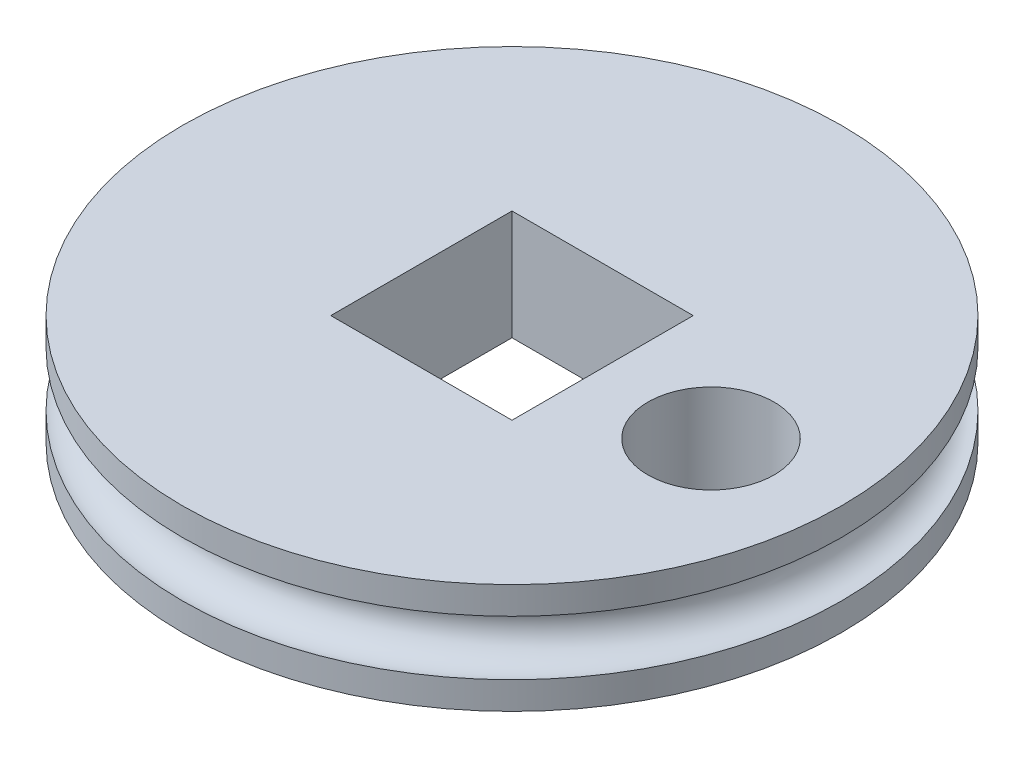
ISO-10303-21;
HEADER;
FILE_DESCRIPTION(('STEP AP214'),'2;1');
FILE_NAME('part.step','',(''),(''),'','','');
FILE_SCHEMA(('AUTOMOTIVE_DESIGN { 1 0 10303 214 1 1 1 1 }'));
ENDSEC;
DATA;
#1=APPLICATION_CONTEXT('core data for automotive mechanical design processes');
#2=APPLICATION_PROTOCOL_DEFINITION('international standard','automotive_design',2000,#1);
#3=PRODUCT_CONTEXT('',#1,'mechanical');
#4=PRODUCT('Part','Part','',(#3));
#5=PRODUCT_RELATED_PRODUCT_CATEGORY('part','',(#4));
#6=PRODUCT_DEFINITION_FORMATION('','',#4);
#7=PRODUCT_DEFINITION_CONTEXT('part definition',#1,'design');
#8=PRODUCT_DEFINITION('design','',#6,#7);
#9=PRODUCT_DEFINITION_SHAPE('','',#8);
#10=(LENGTH_UNIT() NAMED_UNIT(*) SI_UNIT(.MILLI.,.METRE.));
#11=(NAMED_UNIT(*) PLANE_ANGLE_UNIT() SI_UNIT($,.RADIAN.));
#12=(NAMED_UNIT(*) SI_UNIT($,.STERADIAN.) SOLID_ANGLE_UNIT());
#13=UNCERTAINTY_MEASURE_WITH_UNIT(LENGTH_MEASURE(1.E-05),#10,'distance_accuracy_value','');
#14=(GEOMETRIC_REPRESENTATION_CONTEXT(3) GLOBAL_UNCERTAINTY_ASSIGNED_CONTEXT((#13)) GLOBAL_UNIT_ASSIGNED_CONTEXT((#10,
#11,#12)) REPRESENTATION_CONTEXT('',''));
#15=CARTESIAN_POINT('',(0.,0.,0.));
#16=DIRECTION('',(0.,0.,1.));
#17=DIRECTION('',(1.,0.,0.));
#18=AXIS2_PLACEMENT_3D('',#15,#16,#17);
#19=CARTESIAN_POINT('',(0.,2.,0.));
#20=DIRECTION('',(0.,-1.,0.));
#21=DIRECTION('',(0.,0.,-1.));
#22=AXIS2_PLACEMENT_3D('',#19,#20,#21);
#23=CYLINDRICAL_SURFACE('',#22,6.);
#24=CARTESIAN_POINT('',(0.,1.5,0.));
#25=DIRECTION('',(0.,1.,0.));
#26=DIRECTION('',(0.,0.,1.));
#27=AXIS2_PLACEMENT_3D('',#24,#25,#26);
#28=CIRCLE('',#27,6.);
#29=CARTESIAN_POINT('',(0.,1.5,6.));
#30=VERTEX_POINT('',#29);
#31=EDGE_CURVE('E162',#30,#30,#28,.T.);
#32=ORIENTED_EDGE('',*,*,#31,.T.);
#33=EDGE_LOOP('',(#32));
#34=FACE_BOUND('',#33,.T.);
#35=CARTESIAN_POINT('',(0.,2.,0.));
#36=DIRECTION('',(0.,1.,0.));
#37=DIRECTION('',(0.,0.,1.));
#38=AXIS2_PLACEMENT_3D('',#35,#36,#37);
#39=CIRCLE('',#38,6.);
#40=CARTESIAN_POINT('',(0.,2.,6.));
#41=VERTEX_POINT('',#40);
#42=EDGE_CURVE('E122',#41,#41,#39,.T.);
#43=ORIENTED_EDGE('',*,*,#42,.F.);
#44=EDGE_LOOP('',(#43));
#45=FACE_BOUND('',#44,.T.);
#46=ADVANCED_FACE('F43',(#34,#45),#23,.T.);
#47=CARTESIAN_POINT('',(0.,0.5,0.));
#48=DIRECTION('',(0.,1.,0.));
#49=DIRECTION('',(0.,0.,1.));
#50=AXIS2_PLACEMENT_3D('',#47,#48,#49);
#51=CIRCLE('',#50,6.);
#52=CARTESIAN_POINT('',(0.,0.5,6.));
#53=VERTEX_POINT('',#52);
#54=EDGE_CURVE('E173',#53,#53,#51,.T.);
#55=ORIENTED_EDGE('',*,*,#54,.F.);
#56=EDGE_LOOP('',(#55));
#57=FACE_BOUND('',#56,.T.);
#58=CARTESIAN_POINT('',(0.,0.,0.));
#59=DIRECTION('',(0.,1.,0.));
#60=DIRECTION('',(0.,0.,1.));
#61=AXIS2_PLACEMENT_3D('',#58,#59,#60);
#62=CIRCLE('',#61,6.);
#63=CARTESIAN_POINT('',(0.,0.,6.));
#64=VERTEX_POINT('',#63);
#65=EDGE_CURVE('E117',#64,#64,#62,.T.);
#66=ORIENTED_EDGE('',*,*,#65,.T.);
#67=EDGE_LOOP('',(#66));
#68=FACE_BOUND('',#67,.T.);
#69=ADVANCED_FACE('F45',(#57,#68),#23,.T.);
#70=CARTESIAN_POINT('',(0.,2.,0.));
#71=DIRECTION('',(0.,1.,0.));
#72=DIRECTION('',(0.,0.,1.));
#73=AXIS2_PLACEMENT_3D('',#70,#71,#72);
#74=PLANE('',#73);
#75=CARTESIAN_POINT('',(3.75,2.,0.12644610797885));
#76=DIRECTION('',(0.,1.,0.));
#77=DIRECTION('',(0.,0.,1.));
#78=AXIS2_PLACEMENT_3D('',#75,#76,#77);
#79=CIRCLE('',#78,1.15);
#80=CARTESIAN_POINT('',(3.75,2.,1.27644610797885));
#81=VERTEX_POINT('',#80);
#82=EDGE_CURVE('E170',#81,#81,#79,.T.);
#83=ORIENTED_EDGE('',*,*,#82,.F.);
#84=EDGE_LOOP('',(#83));
#85=FACE_BOUND('',#84,.T.);
#86=DIRECTION('',(0.,0.,-1.));
#87=VECTOR('',#86,1.);
#88=CARTESIAN_POINT('',(1.65,2.,-1.65));
#89=LINE('',#88,#87);
#90=CARTESIAN_POINT('',(1.65,2.,1.65));
#91=VERTEX_POINT('',#90);
#92=CARTESIAN_POINT('',(1.65,2.,-1.65));
#93=VERTEX_POINT('',#92);
#94=EDGE_CURVE('E60',#91,#93,#89,.T.);
#95=ORIENTED_EDGE('',*,*,#94,.F.);
#96=DIRECTION('',(1.,0.,0.));
#97=VECTOR('',#96,1.);
#98=CARTESIAN_POINT('',(1.65,2.,1.65));
#99=LINE('',#98,#97);
#100=CARTESIAN_POINT('',(-1.65,2.,1.65));
#101=VERTEX_POINT('',#100);
#102=EDGE_CURVE('E107',#101,#91,#99,.T.);
#103=ORIENTED_EDGE('',*,*,#102,.F.);
#104=DIRECTION('',(0.,0.,1.));
#105=VECTOR('',#104,1.);
#106=CARTESIAN_POINT('',(-1.65,2.,-1.65));
#107=LINE('',#106,#105);
#108=CARTESIAN_POINT('',(-1.65,2.,-1.65));
#109=VERTEX_POINT('',#108);
#110=EDGE_CURVE('E89',#109,#101,#107,.T.);
#111=ORIENTED_EDGE('',*,*,#110,.F.);
#112=DIRECTION('',(-1.,0.,0.));
#113=VECTOR('',#112,1.);
#114=CARTESIAN_POINT('',(1.65,2.,-1.65));
#115=LINE('',#114,#113);
#116=EDGE_CURVE('E99',#93,#109,#115,.T.);
#117=ORIENTED_EDGE('',*,*,#116,.F.);
#118=EDGE_LOOP('',(#95,#103,#111,#117));
#119=FACE_BOUND('',#118,.T.);
#120=ORIENTED_EDGE('',*,*,#42,.T.);
#121=EDGE_LOOP('',(#120));
#122=FACE_BOUND('',#121,.T.);
#123=ADVANCED_FACE('F104',(#85,#119,#122),#74,.T.);
#124=CARTESIAN_POINT('',(0.,0.,0.));
#125=DIRECTION('',(0.,1.,0.));
#126=DIRECTION('',(0.,0.,1.));
#127=AXIS2_PLACEMENT_3D('',#124,#125,#126);
#128=PLANE('',#127);
#129=CARTESIAN_POINT('',(3.75,0.,0.12644610797885));
#130=DIRECTION('',(0.,1.,0.));
#131=DIRECTION('',(0.,0.,1.));
#132=AXIS2_PLACEMENT_3D('',#129,#130,#131);
#133=CIRCLE('',#132,1.15);
#134=CARTESIAN_POINT('',(3.75,0.,1.27644610797885));
#135=VERTEX_POINT('',#134);
#136=EDGE_CURVE('E47',#135,#135,#133,.T.);
#137=ORIENTED_EDGE('',*,*,#136,.T.);
#138=EDGE_LOOP('',(#137));
#139=FACE_BOUND('',#138,.T.);
#140=DIRECTION('',(1.,0.,0.));
#141=VECTOR('',#140,1.);
#142=CARTESIAN_POINT('',(0.,0.,1.65));
#143=LINE('',#142,#141);
#144=CARTESIAN_POINT('',(-1.65,0.,1.65));
#145=VERTEX_POINT('',#144);
#146=CARTESIAN_POINT('',(1.65,0.,1.65));
#147=VERTEX_POINT('',#146);
#148=EDGE_CURVE('E53',#145,#147,#143,.T.);
#149=ORIENTED_EDGE('',*,*,#148,.T.);
#150=DIRECTION('',(0.,0.,-1.));
#151=VECTOR('',#150,1.);
#152=CARTESIAN_POINT('',(1.65,0.,0.));
#153=LINE('',#152,#151);
#154=CARTESIAN_POINT('',(1.65,0.,-1.65));
#155=VERTEX_POINT('',#154);
#156=EDGE_CURVE('E11',#147,#155,#153,.T.);
#157=ORIENTED_EDGE('',*,*,#156,.T.);
#158=DIRECTION('',(-1.,0.,0.));
#159=VECTOR('',#158,1.);
#160=CARTESIAN_POINT('',(0.,0.,-1.65));
#161=LINE('',#160,#159);
#162=CARTESIAN_POINT('',(-1.65,0.,-1.65));
#163=VERTEX_POINT('',#162);
#164=EDGE_CURVE('E126',#155,#163,#161,.T.);
#165=ORIENTED_EDGE('',*,*,#164,.T.);
#166=DIRECTION('',(0.,0.,1.));
#167=VECTOR('',#166,1.);
#168=CARTESIAN_POINT('',(-1.65,0.,0.));
#169=LINE('',#168,#167);
#170=EDGE_CURVE('E92',#163,#145,#169,.T.);
#171=ORIENTED_EDGE('',*,*,#170,.T.);
#172=EDGE_LOOP('',(#149,#157,#165,#171));
#173=FACE_BOUND('',#172,.T.);
#174=ORIENTED_EDGE('',*,*,#65,.F.);
#175=EDGE_LOOP('',(#174));
#176=FACE_BOUND('',#175,.T.);
#177=ADVANCED_FACE('F137',(#139,#173,#176),#128,.F.);
#178=CARTESIAN_POINT('',(1.65,-1.,-1.65));
#179=DIRECTION('',(1.,0.,0.));
#180=DIRECTION('',(0.,0.,-1.));
#181=AXIS2_PLACEMENT_3D('',#178,#179,#180);
#182=PLANE('',#181);
#183=DIRECTION('',(0.,1.,0.));
#184=VECTOR('',#183,1.);
#185=CARTESIAN_POINT('',(1.65,-1.,1.65));
#186=LINE('',#185,#184);
#187=EDGE_CURVE('E114',#147,#91,#186,.T.);
#188=ORIENTED_EDGE('',*,*,#187,.T.);
#189=ORIENTED_EDGE('',*,*,#94,.T.);
#190=DIRECTION('',(0.,1.,0.));
#191=VECTOR('',#190,1.);
#192=CARTESIAN_POINT('',(1.65,-1.,-1.65));
#193=LINE('',#192,#191);
#194=EDGE_CURVE('E96',#155,#93,#193,.T.);
#195=ORIENTED_EDGE('',*,*,#194,.F.);
#196=ORIENTED_EDGE('',*,*,#156,.F.);
#197=EDGE_LOOP('',(#188,#189,#195,#196));
#198=FACE_BOUND('',#197,.T.);
#199=ADVANCED_FACE('F142',(#198),#182,.F.);
#200=CARTESIAN_POINT('',(1.65,-1.,1.65));
#201=DIRECTION('',(0.,0.,1.));
#202=DIRECTION('',(1.,0.,0.));
#203=AXIS2_PLACEMENT_3D('',#200,#201,#202);
#204=PLANE('',#203);
#205=DIRECTION('',(0.,1.,0.));
#206=VECTOR('',#205,1.);
#207=CARTESIAN_POINT('',(-1.65,-1.,1.65));
#208=LINE('',#207,#206);
#209=EDGE_CURVE('E95',#145,#101,#208,.T.);
#210=ORIENTED_EDGE('',*,*,#209,.T.);
#211=ORIENTED_EDGE('',*,*,#102,.T.);
#212=ORIENTED_EDGE('',*,*,#187,.F.);
#213=ORIENTED_EDGE('',*,*,#148,.F.);
#214=EDGE_LOOP('',(#210,#211,#212,#213));
#215=FACE_BOUND('',#214,.T.);
#216=ADVANCED_FACE('F141',(#215),#204,.F.);
#217=CARTESIAN_POINT('',(-1.65,-1.,-1.65));
#218=DIRECTION('',(-1.,0.,0.));
#219=DIRECTION('',(0.,0.,1.));
#220=AXIS2_PLACEMENT_3D('',#217,#218,#219);
#221=PLANE('',#220);
#222=DIRECTION('',(0.,1.,0.));
#223=VECTOR('',#222,1.);
#224=CARTESIAN_POINT('',(-1.65,-1.,-1.65));
#225=LINE('',#224,#223);
#226=EDGE_CURVE('E68',#163,#109,#225,.T.);
#227=ORIENTED_EDGE('',*,*,#226,.T.);
#228=ORIENTED_EDGE('',*,*,#110,.T.);
#229=ORIENTED_EDGE('',*,*,#209,.F.);
#230=ORIENTED_EDGE('',*,*,#170,.F.);
#231=EDGE_LOOP('',(#227,#228,#229,#230));
#232=FACE_BOUND('',#231,.T.);
#233=ADVANCED_FACE('F86',(#232),#221,.F.);
#234=CARTESIAN_POINT('',(1.65,-1.,-1.65));
#235=DIRECTION('',(0.,0.,-1.));
#236=DIRECTION('',(-1.,0.,0.));
#237=AXIS2_PLACEMENT_3D('',#234,#235,#236);
#238=PLANE('',#237);
#239=ORIENTED_EDGE('',*,*,#194,.T.);
#240=ORIENTED_EDGE('',*,*,#116,.T.);
#241=ORIENTED_EDGE('',*,*,#226,.F.);
#242=ORIENTED_EDGE('',*,*,#164,.F.);
#243=EDGE_LOOP('',(#239,#240,#241,#242));
#244=FACE_BOUND('',#243,.T.);
#245=ADVANCED_FACE('F100',(#244),#238,.F.);
#246=CARTESIAN_POINT('',(3.75,-1.,0.12644610797885));
#247=DIRECTION('',(0.,1.,0.));
#248=DIRECTION('',(0.,0.,1.));
#249=AXIS2_PLACEMENT_3D('',#246,#247,#248);
#250=CYLINDRICAL_SURFACE('',#249,1.15);
#251=ORIENTED_EDGE('',*,*,#82,.T.);
#252=EDGE_LOOP('',(#251));
#253=FACE_BOUND('',#252,.T.);
#254=ORIENTED_EDGE('',*,*,#136,.F.);
#255=EDGE_LOOP('',(#254));
#256=FACE_BOUND('',#255,.T.);
#257=ADVANCED_FACE('F189',(#253,#256),#250,.F.);
#258=CARTESIAN_POINT('',(0.,1.,0.));
#259=DIRECTION('',(0.,1.,0.));
#260=DIRECTION('',(0.,0.,1.));
#261=AXIS2_PLACEMENT_3D('',#258,#259,#260);
#262=TOROIDAL_SURFACE('',#261,5.89561917194994,0.510779166826934);
#263=ORIENTED_EDGE('',*,*,#31,.F.);
#264=EDGE_LOOP('',(#263));
#265=FACE_BOUND('',#264,.T.);
#266=ORIENTED_EDGE('',*,*,#54,.T.);
#267=EDGE_LOOP('',(#266));
#268=FACE_BOUND('',#267,.T.);
#269=ADVANCED_FACE('F185',(#265,#268),#262,.F.);
#270=CLOSED_SHELL('',(#46,#69,#123,#177,#199,#216,#233,#245,#257,#269));
#271=MANIFOLD_SOLID_BREP('B2',#270);
#272=ADVANCED_BREP_SHAPE_REPRESENTATION('',(#18,#271),#14);
#273=SHAPE_DEFINITION_REPRESENTATION(#9,#272);
ENDSEC;
END-ISO-10303-21;
